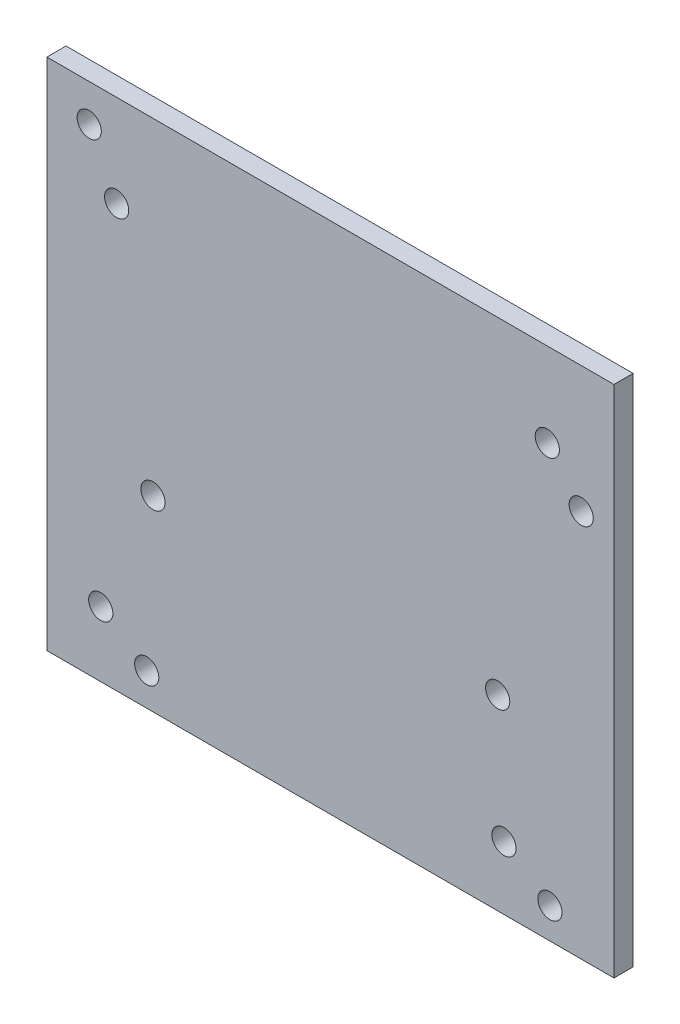
ISO-10303-21;
HEADER;
FILE_DESCRIPTION(('STEP AP214'),'2;1');
FILE_NAME('part.step','',(''),(''),'','','');
FILE_SCHEMA(('AUTOMOTIVE_DESIGN { 1 0 10303 214 1 1 1 1 }'));
ENDSEC;
DATA;
#1=APPLICATION_CONTEXT('core data for automotive mechanical design processes');
#2=APPLICATION_PROTOCOL_DEFINITION('international standard','automotive_design',2000,#1);
#3=PRODUCT_CONTEXT('',#1,'mechanical');
#4=PRODUCT('Part','Part','',(#3));
#5=PRODUCT_RELATED_PRODUCT_CATEGORY('part','',(#4));
#6=PRODUCT_DEFINITION_FORMATION('','',#4);
#7=PRODUCT_DEFINITION_CONTEXT('part definition',#1,'design');
#8=PRODUCT_DEFINITION('design','',#6,#7);
#9=PRODUCT_DEFINITION_SHAPE('','',#8);
#10=(LENGTH_UNIT() NAMED_UNIT(*) SI_UNIT(.MILLI.,.METRE.));
#11=(NAMED_UNIT(*) PLANE_ANGLE_UNIT() SI_UNIT($,.RADIAN.));
#12=(NAMED_UNIT(*) SI_UNIT($,.STERADIAN.) SOLID_ANGLE_UNIT());
#13=UNCERTAINTY_MEASURE_WITH_UNIT(LENGTH_MEASURE(1.E-05),#10,'distance_accuracy_value','');
#14=(GEOMETRIC_REPRESENTATION_CONTEXT(3) GLOBAL_UNCERTAINTY_ASSIGNED_CONTEXT((#13)) GLOBAL_UNIT_ASSIGNED_CONTEXT((#10,
#11,#12)) REPRESENTATION_CONTEXT('',''));
#15=CARTESIAN_POINT('',(0.,0.,0.));
#16=DIRECTION('',(0.,0.,1.));
#17=DIRECTION('',(1.,0.,0.));
#18=AXIS2_PLACEMENT_3D('',#15,#16,#17);
#19=CARTESIAN_POINT('',(0.,0.,6.35));
#20=DIRECTION('',(0.,0.,-1.));
#21=DIRECTION('',(-1.,0.,0.));
#22=AXIS2_PLACEMENT_3D('',#19,#20,#21);
#23=PLANE('',#22);
#24=DIRECTION('',(0.,1.,0.));
#25=VECTOR('',#24,1.);
#26=CARTESIAN_POINT('',(-519.807801232322,207.903265585856,6.35));
#27=LINE('',#26,#25);
#28=CARTESIAN_POINT('',(-519.807801232322,207.903265585856,6.35));
#29=VERTEX_POINT('',#28);
#30=CARTESIAN_POINT('',(-519.807801232322,378.345696057406,6.35));
#31=VERTEX_POINT('',#30);
#32=EDGE_CURVE('E91',#29,#31,#27,.T.);
#33=ORIENTED_EDGE('',*,*,#32,.T.);
#34=DIRECTION('',(-1.,0.,0.));
#35=VECTOR('',#34,1.);
#36=CARTESIAN_POINT('',(-707.836839837936,378.345696057406,6.35));
#37=LINE('',#36,#35);
#38=CARTESIAN_POINT('',(-707.836839837936,378.345696057406,6.35));
#39=VERTEX_POINT('',#38);
#40=EDGE_CURVE('E86',#31,#39,#37,.T.);
#41=ORIENTED_EDGE('',*,*,#40,.T.);
#42=DIRECTION('',(0.,-1.,0.));
#43=VECTOR('',#42,1.);
#44=CARTESIAN_POINT('',(-707.836839837936,207.903265585856,6.35));
#45=LINE('',#44,#43);
#46=CARTESIAN_POINT('',(-707.836839837936,207.903265585856,6.35));
#47=VERTEX_POINT('',#46);
#48=EDGE_CURVE('E89',#39,#47,#45,.T.);
#49=ORIENTED_EDGE('',*,*,#48,.T.);
#50=DIRECTION('',(1.,0.,0.));
#51=VECTOR('',#50,1.);
#52=CARTESIAN_POINT('',(-707.836839837936,207.903265585856,6.35));
#53=LINE('',#52,#51);
#54=EDGE_CURVE('E56',#47,#29,#53,.T.);
#55=ORIENTED_EDGE('',*,*,#54,.T.);
#56=EDGE_LOOP('',(#33,#41,#49,#55));
#57=FACE_BOUND('',#56,.T.);
#58=CARTESIAN_POINT('',(-674.736409601397,218.69826558585,6.35));
#59=DIRECTION('',(0.,0.,1.));
#60=DIRECTION('',(1.,0.,0.));
#61=AXIS2_PLACEMENT_3D('',#58,#59,#60);
#62=CIRCLE('',#61,4.01270000012196);
#63=CARTESIAN_POINT('',(-670.723709601275,218.69826558585,6.35));
#64=VERTEX_POINT('',#63);
#65=EDGE_CURVE('E106',#64,#64,#62,.T.);
#66=ORIENTED_EDGE('',*,*,#65,.F.);
#67=EDGE_LOOP('',(#66));
#68=FACE_BOUND('',#67,.T.);
#69=CARTESIAN_POINT('',(-689.976409601397,229.49326558585,6.35));
#70=DIRECTION('',(0.,0.,1.));
#71=DIRECTION('',(1.,0.,0.));
#72=AXIS2_PLACEMENT_3D('',#69,#70,#71);
#73=CIRCLE('',#72,4.01270000012207);
#74=CARTESIAN_POINT('',(-685.963709601275,229.49326558585,6.35));
#75=VERTEX_POINT('',#74);
#76=EDGE_CURVE('E121',#75,#75,#73,.T.);
#77=ORIENTED_EDGE('',*,*,#76,.F.);
#78=EDGE_LOOP('',(#77));
#79=FACE_BOUND('',#78,.T.);
#80=CARTESIAN_POINT('',(-693.801112975154,366.025192330839,6.35));
#81=DIRECTION('',(0.,0.,1.));
#82=DIRECTION('',(1.,0.,0.));
#83=AXIS2_PLACEMENT_3D('',#80,#81,#82);
#84=CIRCLE('',#83,4.01270000000008);
#85=CARTESIAN_POINT('',(-689.788412975154,366.025192330839,6.35));
#86=VERTEX_POINT('',#85);
#87=EDGE_CURVE('E127',#86,#86,#84,.T.);
#88=ORIENTED_EDGE('',*,*,#87,.F.);
#89=EDGE_LOOP('',(#88));
#90=FACE_BOUND('',#89,.T.);
#91=CARTESIAN_POINT('',(-684.704749339125,347.843833921712,6.35));
#92=DIRECTION('',(0.,0.,1.));
#93=DIRECTION('',(1.,0.,0.));
#94=AXIS2_PLACEMENT_3D('',#91,#92,#93);
#95=CIRCLE('',#94,4.01270000000008);
#96=CARTESIAN_POINT('',(-680.692049339125,347.843833921712,6.35));
#97=VERTEX_POINT('',#96);
#98=EDGE_CURVE('E133',#97,#97,#95,.T.);
#99=ORIENTED_EDGE('',*,*,#98,.F.);
#100=EDGE_LOOP('',(#99));
#101=FACE_BOUND('',#100,.T.);
#102=CARTESIAN_POINT('',(-541.912606261134,350.497238651445,6.35));
#103=DIRECTION('',(0.,0.,1.));
#104=DIRECTION('',(1.,0.,0.));
#105=AXIS2_PLACEMENT_3D('',#102,#103,#104);
#106=CIRCLE('',#105,4.01270000000008);
#107=CARTESIAN_POINT('',(-537.899906261134,350.497238651445,6.35));
#108=VERTEX_POINT('',#107);
#109=EDGE_CURVE('E139',#108,#108,#106,.T.);
#110=ORIENTED_EDGE('',*,*,#109,.F.);
#111=EDGE_LOOP('',(#110));
#112=FACE_BOUND('',#111,.T.);
#113=CARTESIAN_POINT('',(-530.66954825317,336.491038359091,6.35));
#114=DIRECTION('',(0.,0.,1.));
#115=DIRECTION('',(1.,0.,0.));
#116=AXIS2_PLACEMENT_3D('',#113,#114,#115);
#117=CIRCLE('',#116,4.01270000000008);
#118=CARTESIAN_POINT('',(-526.65684825317,336.491038359091,6.35));
#119=VERTEX_POINT('',#118);
#120=EDGE_CURVE('E145',#119,#119,#117,.T.);
#121=ORIENTED_EDGE('',*,*,#120,.F.);
#122=EDGE_LOOP('',(#121));
#123=FACE_BOUND('',#122,.T.);
#124=CARTESIAN_POINT('',(-541.046317861219,218.063265585856,6.35));
#125=DIRECTION('',(0.,0.,1.));
#126=DIRECTION('',(1.,0.,0.));
#127=AXIS2_PLACEMENT_3D('',#124,#125,#126);
#128=CIRCLE('',#127,4.01270000000008);
#129=CARTESIAN_POINT('',(-537.033617861219,218.063265585856,6.35));
#130=VERTEX_POINT('',#129);
#131=EDGE_CURVE('E151',#130,#130,#128,.T.);
#132=ORIENTED_EDGE('',*,*,#131,.F.);
#133=EDGE_LOOP('',(#132));
#134=FACE_BOUND('',#133,.T.);
#135=CARTESIAN_POINT('',(-556.286317861219,228.858265585856,6.35));
#136=DIRECTION('',(0.,0.,1.));
#137=DIRECTION('',(1.,0.,0.));
#138=AXIS2_PLACEMENT_3D('',#135,#136,#137);
#139=CIRCLE('',#138,4.01270000000008);
#140=CARTESIAN_POINT('',(-552.273617861219,228.858265585856,6.35));
#141=VERTEX_POINT('',#140);
#142=EDGE_CURVE('E157',#141,#141,#139,.T.);
#143=ORIENTED_EDGE('',*,*,#142,.F.);
#144=EDGE_LOOP('',(#143));
#145=FACE_BOUND('',#144,.T.);
#146=CARTESIAN_POINT('',(-558.361573731319,269.97258035059,6.35));
#147=DIRECTION('',(0.,0.,1.));
#148=DIRECTION('',(1.,0.,0.));
#149=AXIS2_PLACEMENT_3D('',#146,#147,#148);
#150=CIRCLE('',#149,4.01320000000002);
#151=CARTESIAN_POINT('',(-554.348373731319,269.97258035059,6.35));
#152=VERTEX_POINT('',#151);
#153=EDGE_CURVE('E163',#152,#152,#150,.T.);
#154=ORIENTED_EDGE('',*,*,#153,.F.);
#155=EDGE_LOOP('',(#154));
#156=FACE_BOUND('',#155,.T.);
#157=CARTESIAN_POINT('',(-672.661153731319,269.972580350589,6.35));
#158=DIRECTION('',(0.,0.,1.));
#159=DIRECTION('',(1.,0.,0.));
#160=AXIS2_PLACEMENT_3D('',#157,#158,#159);
#161=CIRCLE('',#160,4.01320000000002);
#162=CARTESIAN_POINT('',(-668.647953731319,269.972580350589,6.35));
#163=VERTEX_POINT('',#162);
#164=EDGE_CURVE('E169',#163,#163,#161,.T.);
#165=ORIENTED_EDGE('',*,*,#164,.F.);
#166=EDGE_LOOP('',(#165));
#167=FACE_BOUND('',#166,.T.);
#168=ADVANCED_FACE('F39',(#57,#68,#79,#90,#101,#112,#123,#134,#145,#156,#167),#23,.F.);
#169=CARTESIAN_POINT('',(0.,0.,0.));
#170=DIRECTION('',(0.,0.,-1.));
#171=DIRECTION('',(-1.,0.,0.));
#172=AXIS2_PLACEMENT_3D('',#169,#170,#171);
#173=PLANE('',#172);
#174=CARTESIAN_POINT('',(-558.361573731319,269.97258035059,0.));
#175=DIRECTION('',(0.,0.,1.));
#176=DIRECTION('',(1.,0.,0.));
#177=AXIS2_PLACEMENT_3D('',#174,#175,#176);
#178=CIRCLE('',#177,4.01320000000002);
#179=CARTESIAN_POINT('',(-554.348373731319,269.97258035059,0.));
#180=VERTEX_POINT('',#179);
#181=EDGE_CURVE('E166',#180,#180,#178,.T.);
#182=ORIENTED_EDGE('',*,*,#181,.T.);
#183=EDGE_LOOP('',(#182));
#184=FACE_BOUND('',#183,.T.);
#185=CARTESIAN_POINT('',(-541.046317861219,218.063265585856,0.));
#186=DIRECTION('',(0.,0.,1.));
#187=DIRECTION('',(1.,0.,0.));
#188=AXIS2_PLACEMENT_3D('',#185,#186,#187);
#189=CIRCLE('',#188,4.01270000000008);
#190=CARTESIAN_POINT('',(-537.033617861219,218.063265585856,0.));
#191=VERTEX_POINT('',#190);
#192=EDGE_CURVE('E154',#191,#191,#189,.T.);
#193=ORIENTED_EDGE('',*,*,#192,.T.);
#194=EDGE_LOOP('',(#193));
#195=FACE_BOUND('',#194,.T.);
#196=CARTESIAN_POINT('',(-541.912606261134,350.497238651445,0.));
#197=DIRECTION('',(0.,0.,1.));
#198=DIRECTION('',(1.,0.,0.));
#199=AXIS2_PLACEMENT_3D('',#196,#197,#198);
#200=CIRCLE('',#199,4.01270000000008);
#201=CARTESIAN_POINT('',(-537.899906261134,350.497238651445,0.));
#202=VERTEX_POINT('',#201);
#203=EDGE_CURVE('E142',#202,#202,#200,.T.);
#204=ORIENTED_EDGE('',*,*,#203,.T.);
#205=EDGE_LOOP('',(#204));
#206=FACE_BOUND('',#205,.T.);
#207=CARTESIAN_POINT('',(-693.801112975154,366.025192330839,0.));
#208=DIRECTION('',(0.,0.,1.));
#209=DIRECTION('',(1.,0.,0.));
#210=AXIS2_PLACEMENT_3D('',#207,#208,#209);
#211=CIRCLE('',#210,4.01270000000008);
#212=CARTESIAN_POINT('',(-689.788412975154,366.025192330839,0.));
#213=VERTEX_POINT('',#212);
#214=EDGE_CURVE('E130',#213,#213,#211,.T.);
#215=ORIENTED_EDGE('',*,*,#214,.T.);
#216=EDGE_LOOP('',(#215));
#217=FACE_BOUND('',#216,.T.);
#218=CARTESIAN_POINT('',(-674.736409601397,218.69826558585,0.));
#219=DIRECTION('',(0.,0.,1.));
#220=DIRECTION('',(1.,0.,0.));
#221=AXIS2_PLACEMENT_3D('',#218,#219,#220);
#222=CIRCLE('',#221,4.01270000012196);
#223=CARTESIAN_POINT('',(-670.723709601275,218.69826558585,0.));
#224=VERTEX_POINT('',#223);
#225=EDGE_CURVE('E118',#224,#224,#222,.T.);
#226=ORIENTED_EDGE('',*,*,#225,.T.);
#227=EDGE_LOOP('',(#226));
#228=FACE_BOUND('',#227,.T.);
#229=DIRECTION('',(0.,1.,0.));
#230=VECTOR('',#229,1.);
#231=CARTESIAN_POINT('',(-519.807801232322,207.903265585856,0.));
#232=LINE('',#231,#230);
#233=CARTESIAN_POINT('',(-519.807801232322,207.903265585856,0.));
#234=VERTEX_POINT('',#233);
#235=CARTESIAN_POINT('',(-519.807801232322,378.345696057406,0.));
#236=VERTEX_POINT('',#235);
#237=EDGE_CURVE('E103',#234,#236,#232,.T.);
#238=ORIENTED_EDGE('',*,*,#237,.F.);
#239=DIRECTION('',(1.,0.,0.));
#240=VECTOR('',#239,1.);
#241=CARTESIAN_POINT('',(-707.836839837936,207.903265585856,0.));
#242=LINE('',#241,#240);
#243=CARTESIAN_POINT('',(-707.836839837936,207.903265585856,0.));
#244=VERTEX_POINT('',#243);
#245=EDGE_CURVE('E79',#244,#234,#242,.T.);
#246=ORIENTED_EDGE('',*,*,#245,.F.);
#247=DIRECTION('',(0.,-1.,0.));
#248=VECTOR('',#247,1.);
#249=CARTESIAN_POINT('',(-707.836839837936,207.903265585856,0.));
#250=LINE('',#249,#248);
#251=CARTESIAN_POINT('',(-707.836839837936,378.345696057406,0.));
#252=VERTEX_POINT('',#251);
#253=EDGE_CURVE('E73',#252,#244,#250,.T.);
#254=ORIENTED_EDGE('',*,*,#253,.F.);
#255=DIRECTION('',(-1.,0.,0.));
#256=VECTOR('',#255,1.);
#257=CARTESIAN_POINT('',(-707.836839837936,378.345696057406,0.));
#258=LINE('',#257,#256);
#259=EDGE_CURVE('E95',#236,#252,#258,.T.);
#260=ORIENTED_EDGE('',*,*,#259,.F.);
#261=EDGE_LOOP('',(#238,#246,#254,#260));
#262=FACE_BOUND('',#261,.T.);
#263=CARTESIAN_POINT('',(-689.976409601397,229.49326558585,0.));
#264=DIRECTION('',(0.,0.,1.));
#265=DIRECTION('',(1.,0.,0.));
#266=AXIS2_PLACEMENT_3D('',#263,#264,#265);
#267=CIRCLE('',#266,4.01270000012207);
#268=CARTESIAN_POINT('',(-685.963709601275,229.49326558585,0.));
#269=VERTEX_POINT('',#268);
#270=EDGE_CURVE('E124',#269,#269,#267,.T.);
#271=ORIENTED_EDGE('',*,*,#270,.T.);
#272=EDGE_LOOP('',(#271));
#273=FACE_BOUND('',#272,.T.);
#274=CARTESIAN_POINT('',(-684.704749339125,347.843833921712,0.));
#275=DIRECTION('',(0.,0.,1.));
#276=DIRECTION('',(1.,0.,0.));
#277=AXIS2_PLACEMENT_3D('',#274,#275,#276);
#278=CIRCLE('',#277,4.01270000000008);
#279=CARTESIAN_POINT('',(-680.692049339125,347.843833921712,0.));
#280=VERTEX_POINT('',#279);
#281=EDGE_CURVE('E136',#280,#280,#278,.T.);
#282=ORIENTED_EDGE('',*,*,#281,.T.);
#283=EDGE_LOOP('',(#282));
#284=FACE_BOUND('',#283,.T.);
#285=CARTESIAN_POINT('',(-530.66954825317,336.491038359091,0.));
#286=DIRECTION('',(0.,0.,1.));
#287=DIRECTION('',(1.,0.,0.));
#288=AXIS2_PLACEMENT_3D('',#285,#286,#287);
#289=CIRCLE('',#288,4.01270000000008);
#290=CARTESIAN_POINT('',(-526.65684825317,336.491038359091,0.));
#291=VERTEX_POINT('',#290);
#292=EDGE_CURVE('E148',#291,#291,#289,.T.);
#293=ORIENTED_EDGE('',*,*,#292,.T.);
#294=EDGE_LOOP('',(#293));
#295=FACE_BOUND('',#294,.T.);
#296=CARTESIAN_POINT('',(-556.286317861219,228.858265585856,0.));
#297=DIRECTION('',(0.,0.,1.));
#298=DIRECTION('',(1.,0.,0.));
#299=AXIS2_PLACEMENT_3D('',#296,#297,#298);
#300=CIRCLE('',#299,4.01270000000008);
#301=CARTESIAN_POINT('',(-552.273617861219,228.858265585856,0.));
#302=VERTEX_POINT('',#301);
#303=EDGE_CURVE('E160',#302,#302,#300,.T.);
#304=ORIENTED_EDGE('',*,*,#303,.T.);
#305=EDGE_LOOP('',(#304));
#306=FACE_BOUND('',#305,.T.);
#307=CARTESIAN_POINT('',(-672.661153731319,269.972580350589,0.));
#308=DIRECTION('',(0.,0.,1.));
#309=DIRECTION('',(1.,0.,0.));
#310=AXIS2_PLACEMENT_3D('',#307,#308,#309);
#311=CIRCLE('',#310,4.01320000000002);
#312=CARTESIAN_POINT('',(-668.647953731319,269.972580350589,0.));
#313=VERTEX_POINT('',#312);
#314=EDGE_CURVE('E172',#313,#313,#311,.T.);
#315=ORIENTED_EDGE('',*,*,#314,.T.);
#316=EDGE_LOOP('',(#315));
#317=FACE_BOUND('',#316,.T.);
#318=ADVANCED_FACE('F114',(#184,#195,#206,#217,#228,#262,#273,#284,#295,#306,#317),#173,.T.);
#319=CARTESIAN_POINT('',(-519.807801232322,207.903265585856,6.35));
#320=DIRECTION('',(-1.,0.,0.));
#321=DIRECTION('',(0.,0.,1.));
#322=AXIS2_PLACEMENT_3D('',#319,#320,#321);
#323=PLANE('',#322);
#324=ORIENTED_EDGE('',*,*,#237,.T.);
#325=DIRECTION('',(0.,0.,-1.));
#326=VECTOR('',#325,1.);
#327=CARTESIAN_POINT('',(-519.807801232322,378.345696057406,6.35));
#328=LINE('',#327,#326);
#329=EDGE_CURVE('E11',#31,#236,#328,.T.);
#330=ORIENTED_EDGE('',*,*,#329,.F.);
#331=ORIENTED_EDGE('',*,*,#32,.F.);
#332=DIRECTION('',(0.,0.,-1.));
#333=VECTOR('',#332,1.);
#334=CARTESIAN_POINT('',(-519.807801232322,207.903265585856,6.35));
#335=LINE('',#334,#333);
#336=EDGE_CURVE('E99',#29,#234,#335,.T.);
#337=ORIENTED_EDGE('',*,*,#336,.T.);
#338=EDGE_LOOP('',(#324,#330,#331,#337));
#339=FACE_BOUND('',#338,.T.);
#340=ADVANCED_FACE('F41',(#339),#323,.F.);
#341=CARTESIAN_POINT('',(-707.836839837936,378.345696057406,6.35));
#342=DIRECTION('',(0.,-1.,0.));
#343=DIRECTION('',(0.,0.,-1.));
#344=AXIS2_PLACEMENT_3D('',#341,#342,#343);
#345=PLANE('',#344);
#346=ORIENTED_EDGE('',*,*,#259,.T.);
#347=DIRECTION('',(0.,0.,-1.));
#348=VECTOR('',#347,1.);
#349=CARTESIAN_POINT('',(-707.836839837936,378.345696057406,6.35));
#350=LINE('',#349,#348);
#351=EDGE_CURVE('E48',#39,#252,#350,.T.);
#352=ORIENTED_EDGE('',*,*,#351,.F.);
#353=ORIENTED_EDGE('',*,*,#40,.F.);
#354=ORIENTED_EDGE('',*,*,#329,.T.);
#355=EDGE_LOOP('',(#346,#352,#353,#354));
#356=FACE_BOUND('',#355,.T.);
#357=ADVANCED_FACE('F94',(#356),#345,.F.);
#358=CARTESIAN_POINT('',(-707.836839837936,207.903265585856,6.35));
#359=DIRECTION('',(1.,0.,0.));
#360=DIRECTION('',(0.,0.,-1.));
#361=AXIS2_PLACEMENT_3D('',#358,#359,#360);
#362=PLANE('',#361);
#363=ORIENTED_EDGE('',*,*,#253,.T.);
#364=DIRECTION('',(0.,0.,-1.));
#365=VECTOR('',#364,1.);
#366=CARTESIAN_POINT('',(-707.836839837936,207.903265585856,6.35));
#367=LINE('',#366,#365);
#368=EDGE_CURVE('E96',#47,#244,#367,.T.);
#369=ORIENTED_EDGE('',*,*,#368,.F.);
#370=ORIENTED_EDGE('',*,*,#48,.F.);
#371=ORIENTED_EDGE('',*,*,#351,.T.);
#372=EDGE_LOOP('',(#363,#369,#370,#371));
#373=FACE_BOUND('',#372,.T.);
#374=ADVANCED_FACE('F97',(#373),#362,.F.);
#375=CARTESIAN_POINT('',(-707.836839837936,207.903265585856,6.35));
#376=DIRECTION('',(0.,1.,0.));
#377=DIRECTION('',(0.,0.,1.));
#378=AXIS2_PLACEMENT_3D('',#375,#376,#377);
#379=PLANE('',#378);
#380=ORIENTED_EDGE('',*,*,#245,.T.);
#381=ORIENTED_EDGE('',*,*,#336,.F.);
#382=ORIENTED_EDGE('',*,*,#54,.F.);
#383=ORIENTED_EDGE('',*,*,#368,.T.);
#384=EDGE_LOOP('',(#380,#381,#382,#383));
#385=FACE_BOUND('',#384,.T.);
#386=ADVANCED_FACE('F111',(#385),#379,.F.);
#387=CARTESIAN_POINT('',(-674.736409601397,218.69826558585,6.35));
#388=DIRECTION('',(0.,0.,-1.));
#389=DIRECTION('',(-1.,0.,0.));
#390=AXIS2_PLACEMENT_3D('',#387,#388,#389);
#391=CYLINDRICAL_SURFACE('',#390,4.01270000012196);
#392=ORIENTED_EDGE('',*,*,#65,.T.);
#393=EDGE_LOOP('',(#392));
#394=FACE_BOUND('',#393,.T.);
#395=ORIENTED_EDGE('',*,*,#225,.F.);
#396=EDGE_LOOP('',(#395));
#397=FACE_BOUND('',#396,.T.);
#398=ADVANCED_FACE('F189',(#394,#397),#391,.F.);
#399=CARTESIAN_POINT('',(-689.976409601397,229.49326558585,6.35));
#400=DIRECTION('',(0.,0.,-1.));
#401=DIRECTION('',(-1.,0.,0.));
#402=AXIS2_PLACEMENT_3D('',#399,#400,#401);
#403=CYLINDRICAL_SURFACE('',#402,4.01270000012207);
#404=ORIENTED_EDGE('',*,*,#76,.T.);
#405=EDGE_LOOP('',(#404));
#406=FACE_BOUND('',#405,.T.);
#407=ORIENTED_EDGE('',*,*,#270,.F.);
#408=EDGE_LOOP('',(#407));
#409=FACE_BOUND('',#408,.T.);
#410=ADVANCED_FACE('F234',(#406,#409),#403,.F.);
#411=CARTESIAN_POINT('',(-693.801112975154,366.025192330839,6.35));
#412=DIRECTION('',(0.,0.,-1.));
#413=DIRECTION('',(-1.,0.,0.));
#414=AXIS2_PLACEMENT_3D('',#411,#412,#413);
#415=CYLINDRICAL_SURFACE('',#414,4.01270000000008);
#416=ORIENTED_EDGE('',*,*,#87,.T.);
#417=EDGE_LOOP('',(#416));
#418=FACE_BOUND('',#417,.T.);
#419=ORIENTED_EDGE('',*,*,#214,.F.);
#420=EDGE_LOOP('',(#419));
#421=FACE_BOUND('',#420,.T.);
#422=ADVANCED_FACE('F242',(#418,#421),#415,.F.);
#423=CARTESIAN_POINT('',(-684.704749339125,347.843833921712,6.35));
#424=DIRECTION('',(0.,0.,-1.));
#425=DIRECTION('',(-1.,0.,0.));
#426=AXIS2_PLACEMENT_3D('',#423,#424,#425);
#427=CYLINDRICAL_SURFACE('',#426,4.01270000000008);
#428=ORIENTED_EDGE('',*,*,#98,.T.);
#429=EDGE_LOOP('',(#428));
#430=FACE_BOUND('',#429,.T.);
#431=ORIENTED_EDGE('',*,*,#281,.F.);
#432=EDGE_LOOP('',(#431));
#433=FACE_BOUND('',#432,.T.);
#434=ADVANCED_FACE('F250',(#430,#433),#427,.F.);
#435=CARTESIAN_POINT('',(-541.912606261134,350.497238651445,6.35));
#436=DIRECTION('',(0.,0.,-1.));
#437=DIRECTION('',(-1.,0.,0.));
#438=AXIS2_PLACEMENT_3D('',#435,#436,#437);
#439=CYLINDRICAL_SURFACE('',#438,4.01270000000008);
#440=ORIENTED_EDGE('',*,*,#109,.T.);
#441=EDGE_LOOP('',(#440));
#442=FACE_BOUND('',#441,.T.);
#443=ORIENTED_EDGE('',*,*,#203,.F.);
#444=EDGE_LOOP('',(#443));
#445=FACE_BOUND('',#444,.T.);
#446=ADVANCED_FACE('F259',(#442,#445),#439,.F.);
#447=CARTESIAN_POINT('',(-530.66954825317,336.491038359091,6.35));
#448=DIRECTION('',(0.,0.,-1.));
#449=DIRECTION('',(-1.,0.,0.));
#450=AXIS2_PLACEMENT_3D('',#447,#448,#449);
#451=CYLINDRICAL_SURFACE('',#450,4.01270000000008);
#452=ORIENTED_EDGE('',*,*,#120,.T.);
#453=EDGE_LOOP('',(#452));
#454=FACE_BOUND('',#453,.T.);
#455=ORIENTED_EDGE('',*,*,#292,.F.);
#456=EDGE_LOOP('',(#455));
#457=FACE_BOUND('',#456,.T.);
#458=ADVANCED_FACE('F268',(#454,#457),#451,.F.);
#459=CARTESIAN_POINT('',(-541.046317861219,218.063265585856,6.35));
#460=DIRECTION('',(0.,0.,-1.));
#461=DIRECTION('',(-1.,0.,0.));
#462=AXIS2_PLACEMENT_3D('',#459,#460,#461);
#463=CYLINDRICAL_SURFACE('',#462,4.01270000000008);
#464=ORIENTED_EDGE('',*,*,#131,.T.);
#465=EDGE_LOOP('',(#464));
#466=FACE_BOUND('',#465,.T.);
#467=ORIENTED_EDGE('',*,*,#192,.F.);
#468=EDGE_LOOP('',(#467));
#469=FACE_BOUND('',#468,.T.);
#470=ADVANCED_FACE('F277',(#466,#469),#463,.F.);
#471=CARTESIAN_POINT('',(-556.286317861219,228.858265585856,6.35));
#472=DIRECTION('',(0.,0.,-1.));
#473=DIRECTION('',(-1.,0.,0.));
#474=AXIS2_PLACEMENT_3D('',#471,#472,#473);
#475=CYLINDRICAL_SURFACE('',#474,4.01270000000008);
#476=ORIENTED_EDGE('',*,*,#142,.T.);
#477=EDGE_LOOP('',(#476));
#478=FACE_BOUND('',#477,.T.);
#479=ORIENTED_EDGE('',*,*,#303,.F.);
#480=EDGE_LOOP('',(#479));
#481=FACE_BOUND('',#480,.T.);
#482=ADVANCED_FACE('F286',(#478,#481),#475,.F.);
#483=CARTESIAN_POINT('',(-558.361573731319,269.97258035059,6.35));
#484=DIRECTION('',(0.,0.,-1.));
#485=DIRECTION('',(-1.,0.,0.));
#486=AXIS2_PLACEMENT_3D('',#483,#484,#485);
#487=CYLINDRICAL_SURFACE('',#486,4.01320000000002);
#488=ORIENTED_EDGE('',*,*,#153,.T.);
#489=EDGE_LOOP('',(#488));
#490=FACE_BOUND('',#489,.T.);
#491=ORIENTED_EDGE('',*,*,#181,.F.);
#492=EDGE_LOOP('',(#491));
#493=FACE_BOUND('',#492,.T.);
#494=ADVANCED_FACE('F295',(#490,#493),#487,.F.);
#495=CARTESIAN_POINT('',(-672.661153731319,269.972580350589,6.35));
#496=DIRECTION('',(0.,0.,-1.));
#497=DIRECTION('',(-1.,0.,0.));
#498=AXIS2_PLACEMENT_3D('',#495,#496,#497);
#499=CYLINDRICAL_SURFACE('',#498,4.01320000000002);
#500=ORIENTED_EDGE('',*,*,#164,.T.);
#501=EDGE_LOOP('',(#500));
#502=FACE_BOUND('',#501,.T.);
#503=ORIENTED_EDGE('',*,*,#314,.F.);
#504=EDGE_LOOP('',(#503));
#505=FACE_BOUND('',#504,.T.);
#506=ADVANCED_FACE('F178',(#502,#505),#499,.F.);
#507=CLOSED_SHELL('',(#168,#318,#340,#357,#374,#386,#398,#410,#422,#434,#446,#458,#470,#482,
#494,#506));
#508=MANIFOLD_SOLID_BREP('B2',#507);
#509=ADVANCED_BREP_SHAPE_REPRESENTATION('',(#18,#508),#14);
#510=SHAPE_DEFINITION_REPRESENTATION(#9,#509);
ENDSEC;
END-ISO-10303-21;
